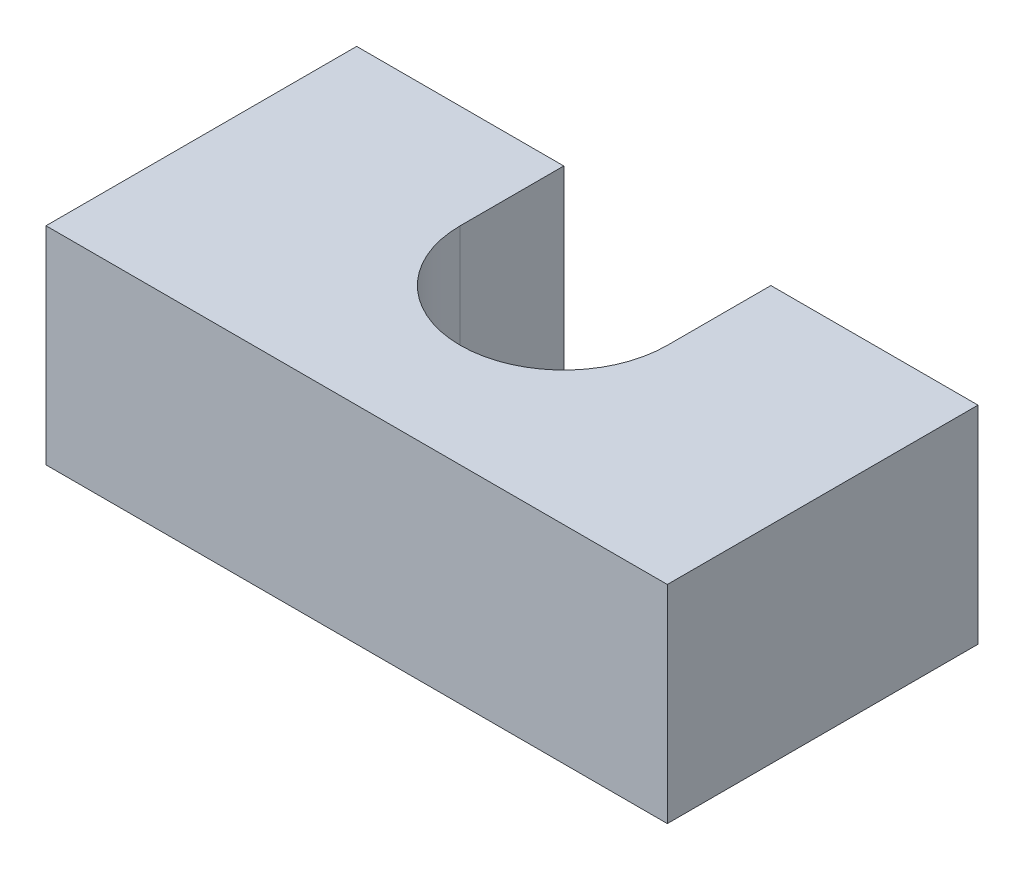
ISO-10303-21;
HEADER;
FILE_DESCRIPTION(('STEP AP214'),'2;1');
FILE_NAME('part.step','',(''),(''),'','','');
FILE_SCHEMA(('AUTOMOTIVE_DESIGN { 1 0 10303 214 1 1 1 1 }'));
ENDSEC;
DATA;
#1=APPLICATION_CONTEXT('core data for automotive mechanical design processes');
#2=APPLICATION_PROTOCOL_DEFINITION('international standard','automotive_design',2000,#1);
#3=PRODUCT_CONTEXT('',#1,'mechanical');
#4=PRODUCT('Part','Part','',(#3));
#5=PRODUCT_RELATED_PRODUCT_CATEGORY('part','',(#4));
#6=PRODUCT_DEFINITION_FORMATION('','',#4);
#7=PRODUCT_DEFINITION_CONTEXT('part definition',#1,'design');
#8=PRODUCT_DEFINITION('design','',#6,#7);
#9=PRODUCT_DEFINITION_SHAPE('','',#8);
#10=(LENGTH_UNIT() NAMED_UNIT(*) SI_UNIT(.MILLI.,.METRE.));
#11=(NAMED_UNIT(*) PLANE_ANGLE_UNIT() SI_UNIT($,.RADIAN.));
#12=(NAMED_UNIT(*) SI_UNIT($,.STERADIAN.) SOLID_ANGLE_UNIT());
#13=UNCERTAINTY_MEASURE_WITH_UNIT(LENGTH_MEASURE(1.E-05),#10,'distance_accuracy_value','');
#14=(GEOMETRIC_REPRESENTATION_CONTEXT(3) GLOBAL_UNCERTAINTY_ASSIGNED_CONTEXT((#13)) GLOBAL_UNIT_ASSIGNED_CONTEXT((#10,
#11,#12)) REPRESENTATION_CONTEXT('',''));
#15=CARTESIAN_POINT('',(0.,0.,0.));
#16=DIRECTION('',(0.,0.,1.));
#17=DIRECTION('',(1.,0.,0.));
#18=AXIS2_PLACEMENT_3D('',#15,#16,#17);
#19=CARTESIAN_POINT('',(-30.,20.,0.));
#20=DIRECTION('',(0.,0.,1.));
#21=DIRECTION('',(1.,0.,0.));
#22=AXIS2_PLACEMENT_3D('',#19,#20,#21);
#23=PLANE('',#22);
#24=DIRECTION('',(-1.,0.,0.));
#25=VECTOR('',#24,1.);
#26=CARTESIAN_POINT('',(-30.,0.,0.));
#27=LINE('',#26,#25);
#28=CARTESIAN_POINT('',(-10.,0.,0.));
#29=VERTEX_POINT('',#28);
#30=CARTESIAN_POINT('',(-30.,0.,0.));
#31=VERTEX_POINT('',#30);
#32=EDGE_CURVE('E133',#29,#31,#27,.T.);
#33=ORIENTED_EDGE('',*,*,#32,.T.);
#34=DIRECTION('',(0.,-1.,0.));
#35=VECTOR('',#34,1.);
#36=CARTESIAN_POINT('',(-30.,20.,0.));
#37=LINE('',#36,#35);
#38=CARTESIAN_POINT('',(-30.,20.,0.));
#39=VERTEX_POINT('',#38);
#40=EDGE_CURVE('E11',#39,#31,#37,.T.);
#41=ORIENTED_EDGE('',*,*,#40,.F.);
#42=DIRECTION('',(-1.,0.,0.));
#43=VECTOR('',#42,1.);
#44=CARTESIAN_POINT('',(-30.,20.,0.));
#45=LINE('',#44,#43);
#46=CARTESIAN_POINT('',(-10.,20.,0.));
#47=VERTEX_POINT('',#46);
#48=EDGE_CURVE('E147',#47,#39,#45,.T.);
#49=ORIENTED_EDGE('',*,*,#48,.F.);
#50=DIRECTION('',(0.,-1.,0.));
#51=VECTOR('',#50,1.);
#52=CARTESIAN_POINT('',(-10.,20.,0.));
#53=LINE('',#52,#51);
#54=EDGE_CURVE('E129',#47,#29,#53,.T.);
#55=ORIENTED_EDGE('',*,*,#54,.T.);
#56=EDGE_LOOP('',(#33,#41,#49,#55));
#57=FACE_BOUND('',#56,.T.);
#58=ADVANCED_FACE('F37',(#57),#23,.F.);
#59=CARTESIAN_POINT('',(-30.,20.,30.));
#60=DIRECTION('',(1.,0.,0.));
#61=DIRECTION('',(0.,0.,-1.));
#62=AXIS2_PLACEMENT_3D('',#59,#60,#61);
#63=PLANE('',#62);
#64=DIRECTION('',(0.,0.,1.));
#65=VECTOR('',#64,1.);
#66=CARTESIAN_POINT('',(-30.,0.,30.));
#67=LINE('',#66,#65);
#68=CARTESIAN_POINT('',(-30.,0.,30.));
#69=VERTEX_POINT('',#68);
#70=EDGE_CURVE('E136',#31,#69,#67,.T.);
#71=ORIENTED_EDGE('',*,*,#70,.T.);
#72=DIRECTION('',(0.,-1.,0.));
#73=VECTOR('',#72,1.);
#74=CARTESIAN_POINT('',(-30.,20.,30.));
#75=LINE('',#74,#73);
#76=CARTESIAN_POINT('',(-30.,20.,30.));
#77=VERTEX_POINT('',#76);
#78=EDGE_CURVE('E45',#77,#69,#75,.T.);
#79=ORIENTED_EDGE('',*,*,#78,.F.);
#80=DIRECTION('',(0.,0.,1.));
#81=VECTOR('',#80,1.);
#82=CARTESIAN_POINT('',(-30.,20.,30.));
#83=LINE('',#82,#81);
#84=EDGE_CURVE('E96',#39,#77,#83,.T.);
#85=ORIENTED_EDGE('',*,*,#84,.F.);
#86=ORIENTED_EDGE('',*,*,#40,.T.);
#87=EDGE_LOOP('',(#71,#79,#85,#86));
#88=FACE_BOUND('',#87,.T.);
#89=ADVANCED_FACE('F182',(#88),#63,.F.);
#90=CARTESIAN_POINT('',(30.,20.,30.));
#91=DIRECTION('',(0.,0.,-1.));
#92=DIRECTION('',(-1.,0.,0.));
#93=AXIS2_PLACEMENT_3D('',#90,#91,#92);
#94=PLANE('',#93);
#95=DIRECTION('',(1.,0.,0.));
#96=VECTOR('',#95,1.);
#97=CARTESIAN_POINT('',(30.,0.,30.));
#98=LINE('',#97,#96);
#99=CARTESIAN_POINT('',(30.,0.,30.));
#100=VERTEX_POINT('',#99);
#101=EDGE_CURVE('E138',#69,#100,#98,.T.);
#102=ORIENTED_EDGE('',*,*,#101,.T.);
#103=DIRECTION('',(0.,-1.,0.));
#104=VECTOR('',#103,1.);
#105=CARTESIAN_POINT('',(30.,20.,30.));
#106=LINE('',#105,#104);
#107=CARTESIAN_POINT('',(30.,20.,30.));
#108=VERTEX_POINT('',#107);
#109=EDGE_CURVE('E154',#108,#100,#106,.T.);
#110=ORIENTED_EDGE('',*,*,#109,.F.);
#111=DIRECTION('',(1.,0.,0.));
#112=VECTOR('',#111,1.);
#113=CARTESIAN_POINT('',(30.,20.,30.));
#114=LINE('',#113,#112);
#115=EDGE_CURVE('E162',#77,#108,#114,.T.);
#116=ORIENTED_EDGE('',*,*,#115,.F.);
#117=ORIENTED_EDGE('',*,*,#78,.T.);
#118=EDGE_LOOP('',(#102,#110,#116,#117));
#119=FACE_BOUND('',#118,.T.);
#120=ADVANCED_FACE('F160',(#119),#94,.F.);
#121=CARTESIAN_POINT('',(30.,20.,30.));
#122=DIRECTION('',(-1.,0.,0.));
#123=DIRECTION('',(0.,0.,1.));
#124=AXIS2_PLACEMENT_3D('',#121,#122,#123);
#125=PLANE('',#124);
#126=DIRECTION('',(0.,0.,-1.));
#127=VECTOR('',#126,1.);
#128=CARTESIAN_POINT('',(30.,0.,30.));
#129=LINE('',#128,#127);
#130=CARTESIAN_POINT('',(30.,0.,0.));
#131=VERTEX_POINT('',#130);
#132=EDGE_CURVE('E140',#100,#131,#129,.T.);
#133=ORIENTED_EDGE('',*,*,#132,.T.);
#134=DIRECTION('',(0.,-1.,0.));
#135=VECTOR('',#134,1.);
#136=CARTESIAN_POINT('',(30.,20.,0.));
#137=LINE('',#136,#135);
#138=CARTESIAN_POINT('',(30.,20.,0.));
#139=VERTEX_POINT('',#138);
#140=EDGE_CURVE('E151',#139,#131,#137,.T.);
#141=ORIENTED_EDGE('',*,*,#140,.F.);
#142=DIRECTION('',(0.,0.,-1.));
#143=VECTOR('',#142,1.);
#144=CARTESIAN_POINT('',(30.,20.,30.));
#145=LINE('',#144,#143);
#146=EDGE_CURVE('E174',#108,#139,#145,.T.);
#147=ORIENTED_EDGE('',*,*,#146,.F.);
#148=ORIENTED_EDGE('',*,*,#109,.T.);
#149=EDGE_LOOP('',(#133,#141,#147,#148));
#150=FACE_BOUND('',#149,.T.);
#151=ADVANCED_FACE('F170',(#150),#125,.F.);
#152=CARTESIAN_POINT('',(30.,20.,0.));
#153=DIRECTION('',(0.,0.,1.));
#154=DIRECTION('',(1.,0.,0.));
#155=AXIS2_PLACEMENT_3D('',#152,#153,#154);
#156=PLANE('',#155);
#157=DIRECTION('',(-1.,0.,0.));
#158=VECTOR('',#157,1.);
#159=CARTESIAN_POINT('',(30.,0.,0.));
#160=LINE('',#159,#158);
#161=CARTESIAN_POINT('',(10.,0.,0.));
#162=VERTEX_POINT('',#161);
#163=EDGE_CURVE('E142',#131,#162,#160,.T.);
#164=ORIENTED_EDGE('',*,*,#163,.T.);
#165=DIRECTION('',(0.,-1.,0.));
#166=VECTOR('',#165,1.);
#167=CARTESIAN_POINT('',(10.,20.,0.));
#168=LINE('',#167,#166);
#169=CARTESIAN_POINT('',(10.,20.,0.));
#170=VERTEX_POINT('',#169);
#171=EDGE_CURVE('E124',#170,#162,#168,.T.);
#172=ORIENTED_EDGE('',*,*,#171,.F.);
#173=DIRECTION('',(-1.,0.,0.));
#174=VECTOR('',#173,1.);
#175=CARTESIAN_POINT('',(30.,20.,0.));
#176=LINE('',#175,#174);
#177=EDGE_CURVE('E115',#139,#170,#176,.T.);
#178=ORIENTED_EDGE('',*,*,#177,.F.);
#179=ORIENTED_EDGE('',*,*,#140,.T.);
#180=EDGE_LOOP('',(#164,#172,#178,#179));
#181=FACE_BOUND('',#180,.T.);
#182=ADVANCED_FACE('F173',(#181),#156,.F.);
#183=CARTESIAN_POINT('',(10.,20.,0.));
#184=DIRECTION('',(1.,0.,0.));
#185=DIRECTION('',(0.,0.,-1.));
#186=AXIS2_PLACEMENT_3D('',#183,#184,#185);
#187=PLANE('',#186);
#188=DIRECTION('',(0.,0.,1.));
#189=VECTOR('',#188,1.);
#190=CARTESIAN_POINT('',(10.,0.,0.));
#191=LINE('',#190,#189);
#192=CARTESIAN_POINT('',(10.,0.,10.));
#193=VERTEX_POINT('',#192);
#194=EDGE_CURVE('E123',#162,#193,#191,.T.);
#195=ORIENTED_EDGE('',*,*,#194,.T.);
#196=DIRECTION('',(0.,-1.,0.));
#197=VECTOR('',#196,1.);
#198=CARTESIAN_POINT('',(10.,20.,10.));
#199=LINE('',#198,#197);
#200=CARTESIAN_POINT('',(10.,20.,10.));
#201=VERTEX_POINT('',#200);
#202=EDGE_CURVE('E120',#201,#193,#199,.T.);
#203=ORIENTED_EDGE('',*,*,#202,.F.);
#204=DIRECTION('',(0.,0.,1.));
#205=VECTOR('',#204,1.);
#206=CARTESIAN_POINT('',(10.,20.,0.));
#207=LINE('',#206,#205);
#208=EDGE_CURVE('E109',#170,#201,#207,.T.);
#209=ORIENTED_EDGE('',*,*,#208,.F.);
#210=ORIENTED_EDGE('',*,*,#171,.T.);
#211=EDGE_LOOP('',(#195,#203,#209,#210));
#212=FACE_BOUND('',#211,.T.);
#213=ADVANCED_FACE('F121',(#212),#187,.F.);
#214=CARTESIAN_POINT('',(0.,20.,10.));
#215=DIRECTION('',(0.,-1.,0.));
#216=DIRECTION('',(0.,0.,-1.));
#217=AXIS2_PLACEMENT_3D('',#214,#215,#216);
#218=CYLINDRICAL_SURFACE('',#217,10.);
#219=CARTESIAN_POINT('',(0.,0.,10.));
#220=DIRECTION('',(0.,-1.,0.));
#221=DIRECTION('',(0.,0.,1.));
#222=AXIS2_PLACEMENT_3D('',#219,#220,#221);
#223=CIRCLE('',#222,10.);
#224=CARTESIAN_POINT('',(-10.,0.,10.));
#225=VERTEX_POINT('',#224);
#226=EDGE_CURVE('E82',#193,#225,#223,.T.);
#227=ORIENTED_EDGE('',*,*,#226,.T.);
#228=DIRECTION('',(0.,-1.,0.));
#229=VECTOR('',#228,1.);
#230=CARTESIAN_POINT('',(-10.,20.,10.));
#231=LINE('',#230,#229);
#232=CARTESIAN_POINT('',(-10.,20.,10.));
#233=VERTEX_POINT('',#232);
#234=EDGE_CURVE('E125',#233,#225,#231,.T.);
#235=ORIENTED_EDGE('',*,*,#234,.F.);
#236=CARTESIAN_POINT('',(0.,20.,10.));
#237=DIRECTION('',(0.,-1.,0.));
#238=DIRECTION('',(0.,0.,1.));
#239=AXIS2_PLACEMENT_3D('',#236,#237,#238);
#240=CIRCLE('',#239,10.);
#241=EDGE_CURVE('E113',#201,#233,#240,.T.);
#242=ORIENTED_EDGE('',*,*,#241,.F.);
#243=ORIENTED_EDGE('',*,*,#202,.T.);
#244=EDGE_LOOP('',(#227,#235,#242,#243));
#245=FACE_BOUND('',#244,.T.);
#246=ADVANCED_FACE('F127',(#245),#218,.F.);
#247=CARTESIAN_POINT('',(-10.,20.,0.));
#248=DIRECTION('',(-1.,0.,0.));
#249=DIRECTION('',(0.,0.,1.));
#250=AXIS2_PLACEMENT_3D('',#247,#248,#249);
#251=PLANE('',#250);
#252=DIRECTION('',(0.,0.,-1.));
#253=VECTOR('',#252,1.);
#254=CARTESIAN_POINT('',(-10.,0.,0.));
#255=LINE('',#254,#253);
#256=EDGE_CURVE('E88',#225,#29,#255,.T.);
#257=ORIENTED_EDGE('',*,*,#256,.T.);
#258=ORIENTED_EDGE('',*,*,#54,.F.);
#259=DIRECTION('',(0.,0.,-1.));
#260=VECTOR('',#259,1.);
#261=CARTESIAN_POINT('',(-10.,20.,0.));
#262=LINE('',#261,#260);
#263=EDGE_CURVE('E53',#233,#47,#262,.T.);
#264=ORIENTED_EDGE('',*,*,#263,.F.);
#265=ORIENTED_EDGE('',*,*,#234,.T.);
#266=EDGE_LOOP('',(#257,#258,#264,#265));
#267=FACE_BOUND('',#266,.T.);
#268=ADVANCED_FACE('F198',(#267),#251,.F.);
#269=CARTESIAN_POINT('',(0.,20.,10.));
#270=DIRECTION('',(0.,1.,0.));
#271=DIRECTION('',(0.,0.,1.));
#272=AXIS2_PLACEMENT_3D('',#269,#270,#271);
#273=PLANE('',#272);
#274=ORIENTED_EDGE('',*,*,#48,.T.);
#275=ORIENTED_EDGE('',*,*,#84,.T.);
#276=ORIENTED_EDGE('',*,*,#115,.T.);
#277=ORIENTED_EDGE('',*,*,#146,.T.);
#278=ORIENTED_EDGE('',*,*,#177,.T.);
#279=ORIENTED_EDGE('',*,*,#208,.T.);
#280=ORIENTED_EDGE('',*,*,#241,.T.);
#281=ORIENTED_EDGE('',*,*,#263,.T.);
#282=EDGE_LOOP('',(#274,#275,#276,#277,#278,#279,#280,#281));
#283=FACE_BOUND('',#282,.T.);
#284=ADVANCED_FACE('F111',(#283),#273,.T.);
#285=CARTESIAN_POINT('',(0.,0.,10.));
#286=DIRECTION('',(0.,1.,0.));
#287=DIRECTION('',(0.,0.,1.));
#288=AXIS2_PLACEMENT_3D('',#285,#286,#287);
#289=PLANE('',#288);
#290=ORIENTED_EDGE('',*,*,#32,.F.);
#291=ORIENTED_EDGE('',*,*,#256,.F.);
#292=ORIENTED_EDGE('',*,*,#226,.F.);
#293=ORIENTED_EDGE('',*,*,#194,.F.);
#294=ORIENTED_EDGE('',*,*,#163,.F.);
#295=ORIENTED_EDGE('',*,*,#132,.F.);
#296=ORIENTED_EDGE('',*,*,#101,.F.);
#297=ORIENTED_EDGE('',*,*,#70,.F.);
#298=EDGE_LOOP('',(#290,#291,#292,#293,#294,#295,#296,#297));
#299=FACE_BOUND('',#298,.T.);
#300=ADVANCED_FACE('F166',(#299),#289,.F.);
#301=CLOSED_SHELL('',(#58,#89,#120,#151,#182,#213,#246,#268,#284,#300));
#302=MANIFOLD_SOLID_BREP('B2',#301);
#303=ADVANCED_BREP_SHAPE_REPRESENTATION('',(#18,#302),#14);
#304=SHAPE_DEFINITION_REPRESENTATION(#9,#303);
ENDSEC;
END-ISO-10303-21;
